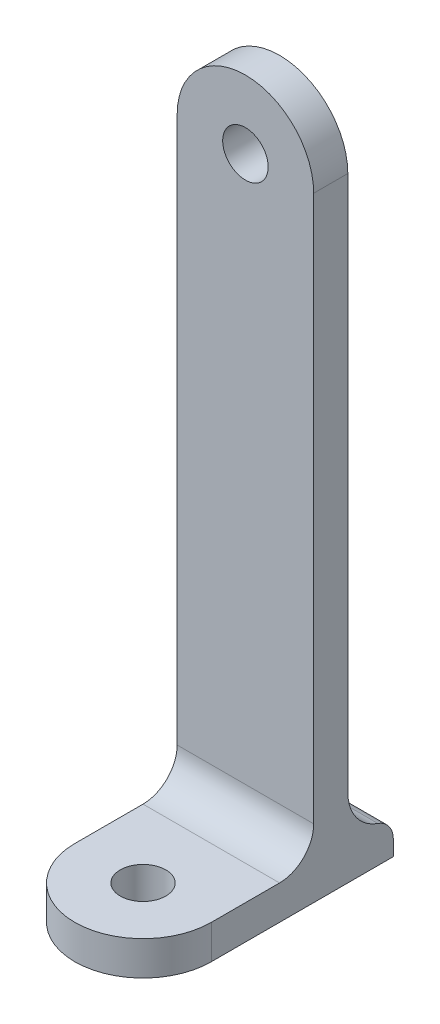
ISO-10303-21;
HEADER;
FILE_DESCRIPTION(('STEP AP214'),'2;1');
FILE_NAME('part.step','',(''),(''),'','','');
FILE_SCHEMA(('AUTOMOTIVE_DESIGN { 1 0 10303 214 1 1 1 1 }'));
ENDSEC;
DATA;
#1=APPLICATION_CONTEXT('core data for automotive mechanical design processes');
#2=APPLICATION_PROTOCOL_DEFINITION('international standard','automotive_design',2000,#1);
#3=PRODUCT_CONTEXT('',#1,'mechanical');
#4=PRODUCT('Part','Part','',(#3));
#5=PRODUCT_RELATED_PRODUCT_CATEGORY('part','',(#4));
#6=PRODUCT_DEFINITION_FORMATION('','',#4);
#7=PRODUCT_DEFINITION_CONTEXT('part definition',#1,'design');
#8=PRODUCT_DEFINITION('design','',#6,#7);
#9=PRODUCT_DEFINITION_SHAPE('','',#8);
#10=(LENGTH_UNIT() NAMED_UNIT(*) SI_UNIT(.MILLI.,.METRE.));
#11=(NAMED_UNIT(*) PLANE_ANGLE_UNIT() SI_UNIT($,.RADIAN.));
#12=(NAMED_UNIT(*) SI_UNIT($,.STERADIAN.) SOLID_ANGLE_UNIT());
#13=UNCERTAINTY_MEASURE_WITH_UNIT(LENGTH_MEASURE(1.E-05),#10,'distance_accuracy_value','');
#14=(GEOMETRIC_REPRESENTATION_CONTEXT(3) GLOBAL_UNCERTAINTY_ASSIGNED_CONTEXT((#13)) GLOBAL_UNIT_ASSIGNED_CONTEXT((#10,
#11,#12)) REPRESENTATION_CONTEXT('',''));
#15=CARTESIAN_POINT('',(0.,0.,0.));
#16=DIRECTION('',(0.,0.,1.));
#17=DIRECTION('',(1.,0.,0.));
#18=AXIS2_PLACEMENT_3D('',#15,#16,#17);
#19=CARTESIAN_POINT('',(-6.,60.,-9.));
#20=DIRECTION('',(0.,0.,1.));
#21=DIRECTION('',(1.,0.,0.));
#22=AXIS2_PLACEMENT_3D('',#19,#20,#21);
#23=PLANE('',#22);
#24=CARTESIAN_POINT('',(0.,54.,-9.));
#25=DIRECTION('',(0.,0.,1.));
#26=DIRECTION('',(1.,0.,0.));
#27=AXIS2_PLACEMENT_3D('',#24,#25,#26);
#28=CIRCLE('',#27,2.);
#29=CARTESIAN_POINT('',(2.,54.,-9.));
#30=VERTEX_POINT('',#29);
#31=EDGE_CURVE('E176',#30,#30,#28,.T.);
#32=ORIENTED_EDGE('',*,*,#31,.F.);
#33=EDGE_LOOP('',(#32));
#34=FACE_BOUND('',#33,.T.);
#35=DIRECTION('',(0.,-1.,0.));
#36=VECTOR('',#35,1.);
#37=CARTESIAN_POINT('',(-6.,60.,-9.));
#38=LINE('',#37,#36);
#39=CARTESIAN_POINT('',(-6.,54.,-9.));
#40=VERTEX_POINT('',#39);
#41=CARTESIAN_POINT('',(-6.,6.,-9.));
#42=VERTEX_POINT('',#41);
#43=EDGE_CURVE('E186',#40,#42,#38,.T.);
#44=ORIENTED_EDGE('',*,*,#43,.T.);
#45=DIRECTION('',(1.,0.,0.));
#46=VECTOR('',#45,1.);
#47=CARTESIAN_POINT('',(6.,6.,-9.00000000000001));
#48=LINE('',#47,#46);
#49=CARTESIAN_POINT('',(6.,6.,-9.00000000000001));
#50=VERTEX_POINT('',#49);
#51=EDGE_CURVE('E224',#42,#50,#48,.T.);
#52=ORIENTED_EDGE('',*,*,#51,.T.);
#53=DIRECTION('',(0.,-1.,0.));
#54=VECTOR('',#53,1.);
#55=CARTESIAN_POINT('',(6.,60.,-9.));
#56=LINE('',#55,#54);
#57=CARTESIAN_POINT('',(6.,54.,-9.));
#58=VERTEX_POINT('',#57);
#59=EDGE_CURVE('E162',#58,#50,#56,.T.);
#60=ORIENTED_EDGE('',*,*,#59,.F.);
#61=CARTESIAN_POINT('',(0.,54.,-9.));
#62=DIRECTION('',(0.,0.,1.));
#63=DIRECTION('',(1.,0.,0.));
#64=AXIS2_PLACEMENT_3D('',#61,#62,#63);
#65=CIRCLE('',#64,6.);
#66=EDGE_CURVE('E172',#58,#40,#65,.T.);
#67=ORIENTED_EDGE('',*,*,#66,.T.);
#68=EDGE_LOOP('',(#44,#52,#60,#67));
#69=FACE_BOUND('',#68,.T.);
#70=ADVANCED_FACE('F77',(#34,#69),#23,.T.);
#71=CARTESIAN_POINT('',(-6.,3.,-12.));
#72=DIRECTION('',(0.,0.,-1.));
#73=DIRECTION('',(-1.,0.,0.));
#74=AXIS2_PLACEMENT_3D('',#71,#72,#73);
#75=PLANE('',#74);
#76=CARTESIAN_POINT('',(0.,54.,-12.));
#77=DIRECTION('',(0.,0.,-1.));
#78=DIRECTION('',(-1.,0.,0.));
#79=AXIS2_PLACEMENT_3D('',#76,#77,#78);
#80=CIRCLE('',#79,2.);
#81=CARTESIAN_POINT('',(-2.00000000000001,54.,-12.));
#82=VERTEX_POINT('',#81);
#83=EDGE_CURVE('E179',#82,#82,#80,.F.);
#84=ORIENTED_EDGE('',*,*,#83,.T.);
#85=EDGE_LOOP('',(#84));
#86=FACE_BOUND('',#85,.T.);
#87=DIRECTION('',(0.,1.,0.));
#88=VECTOR('',#87,1.);
#89=CARTESIAN_POINT('',(6.,3.,-12.));
#90=LINE('',#89,#88);
#91=CARTESIAN_POINT('',(6.,6.9,-12.));
#92=VERTEX_POINT('',#91);
#93=CARTESIAN_POINT('',(6.,54.,-12.));
#94=VERTEX_POINT('',#93);
#95=EDGE_CURVE('E152',#92,#94,#90,.T.);
#96=ORIENTED_EDGE('',*,*,#95,.F.);
#97=DIRECTION('',(1.,0.,0.));
#98=VECTOR('',#97,1.);
#99=CARTESIAN_POINT('',(-6.,6.9,-12.));
#100=LINE('',#99,#98);
#101=CARTESIAN_POINT('',(-6.,6.9,-12.));
#102=VERTEX_POINT('',#101);
#103=EDGE_CURVE('E233',#92,#102,#100,.F.);
#104=ORIENTED_EDGE('',*,*,#103,.T.);
#105=DIRECTION('',(0.,1.,0.));
#106=VECTOR('',#105,1.);
#107=CARTESIAN_POINT('',(-6.,3.,-12.));
#108=LINE('',#107,#106);
#109=CARTESIAN_POINT('',(-6.,54.,-12.));
#110=VERTEX_POINT('',#109);
#111=EDGE_CURVE('E169',#102,#110,#108,.T.);
#112=ORIENTED_EDGE('',*,*,#111,.T.);
#113=CARTESIAN_POINT('',(0.,54.,-12.));
#114=DIRECTION('',(0.,0.,-1.));
#115=DIRECTION('',(-1.,0.,0.));
#116=AXIS2_PLACEMENT_3D('',#113,#114,#115);
#117=CIRCLE('',#116,6.);
#118=EDGE_CURVE('E166',#94,#110,#117,.F.);
#119=ORIENTED_EDGE('',*,*,#118,.F.);
#120=EDGE_LOOP('',(#96,#104,#112,#119));
#121=FACE_BOUND('',#120,.T.);
#122=ADVANCED_FACE('F167',(#86,#121),#75,.T.);
#123=CARTESIAN_POINT('',(6.,3.,0.));
#124=DIRECTION('',(1.,0.,0.));
#125=DIRECTION('',(0.,0.,-1.));
#126=AXIS2_PLACEMENT_3D('',#123,#124,#125);
#127=PLANE('',#126);
#128=DIRECTION('',(0.,-1.,0.));
#129=VECTOR('',#128,1.);
#130=CARTESIAN_POINT('',(6.,3.,-16.));
#131=LINE('',#130,#129);
#132=CARTESIAN_POINT('',(6.,1.31430398249242,-16.));
#133=VERTEX_POINT('',#132);
#134=CARTESIAN_POINT('',(6.,0.,-16.));
#135=VERTEX_POINT('',#134);
#136=EDGE_CURVE('E218',#133,#135,#131,.T.);
#137=ORIENTED_EDGE('',*,*,#136,.F.);
#138=CARTESIAN_POINT('',(6.,1.31430398249242,-14.));
#139=DIRECTION('',(1.,0.,0.));
#140=DIRECTION('',(0.,0.,-1.));
#141=AXIS2_PLACEMENT_3D('',#138,#139,#140);
#142=CIRCLE('',#141,2.);
#143=CARTESIAN_POINT('',(6.,3.20776025961363,-14.6440677966102));
#144=VERTEX_POINT('',#143);
#145=EDGE_CURVE('E99',#133,#144,#142,.T.);
#146=ORIENTED_EDGE('',*,*,#145,.T.);
#147=CARTESIAN_POINT('',(6.,6.9,-15.9));
#148=DIRECTION('',(1.,0.,0.));
#149=DIRECTION('',(0.,0.,-1.));
#150=AXIS2_PLACEMENT_3D('',#147,#148,#149);
#151=CIRCLE('',#150,3.9);
#152=EDGE_CURVE('E159',#144,#92,#151,.F.);
#153=ORIENTED_EDGE('',*,*,#152,.T.);
#154=ORIENTED_EDGE('',*,*,#95,.T.);
#155=DIRECTION('',(0.,0.,1.));
#156=VECTOR('',#155,1.);
#157=CARTESIAN_POINT('',(6.,54.,-16.001));
#158=LINE('',#157,#156);
#159=EDGE_CURVE('E157',#94,#58,#158,.T.);
#160=ORIENTED_EDGE('',*,*,#159,.T.);
#161=ORIENTED_EDGE('',*,*,#59,.T.);
#162=CARTESIAN_POINT('',(6.,6.,-6.));
#163=DIRECTION('',(1.,0.,0.));
#164=DIRECTION('',(0.,0.,-1.));
#165=AXIS2_PLACEMENT_3D('',#162,#163,#164);
#166=CIRCLE('',#165,3.);
#167=CARTESIAN_POINT('',(6.,3.,-6.));
#168=VERTEX_POINT('',#167);
#169=EDGE_CURVE('E229',#50,#168,#166,.F.);
#170=ORIENTED_EDGE('',*,*,#169,.T.);
#171=DIRECTION('',(0.,0.,1.));
#172=VECTOR('',#171,1.);
#173=CARTESIAN_POINT('',(6.,3.,0.));
#174=LINE('',#173,#172);
#175=CARTESIAN_POINT('',(6.,3.,0.));
#176=VERTEX_POINT('',#175);
#177=EDGE_CURVE('E198',#168,#176,#174,.T.);
#178=ORIENTED_EDGE('',*,*,#177,.T.);
#179=DIRECTION('',(0.,-1.,0.));
#180=VECTOR('',#179,1.);
#181=CARTESIAN_POINT('',(6.,3.,0.));
#182=LINE('',#181,#180);
#183=CARTESIAN_POINT('',(6.,0.,0.));
#184=VERTEX_POINT('',#183);
#185=EDGE_CURVE('E220',#176,#184,#182,.T.);
#186=ORIENTED_EDGE('',*,*,#185,.T.);
#187=DIRECTION('',(0.,0.,1.));
#188=VECTOR('',#187,1.);
#189=CARTESIAN_POINT('',(6.,0.,0.));
#190=LINE('',#189,#188);
#191=EDGE_CURVE('E209',#135,#184,#190,.T.);
#192=ORIENTED_EDGE('',*,*,#191,.F.);
#193=EDGE_LOOP('',(#137,#146,#153,#154,#160,#161,#170,#178,#186,#192));
#194=FACE_BOUND('',#193,.T.);
#195=ADVANCED_FACE('F154',(#194),#127,.T.);
#196=CARTESIAN_POINT('',(-6.,3.,0.));
#197=DIRECTION('',(-1.,0.,0.));
#198=DIRECTION('',(0.,0.,1.));
#199=AXIS2_PLACEMENT_3D('',#196,#197,#198);
#200=PLANE('',#199);
#201=CARTESIAN_POINT('',(-6.,6.9,-15.9));
#202=DIRECTION('',(-1.,0.,0.));
#203=DIRECTION('',(0.,0.,1.));
#204=AXIS2_PLACEMENT_3D('',#201,#202,#203);
#205=CIRCLE('',#204,3.9);
#206=CARTESIAN_POINT('',(-6.,3.20776025961364,-14.6440677966102));
#207=VERTEX_POINT('',#206);
#208=EDGE_CURVE('E236',#102,#207,#205,.F.);
#209=ORIENTED_EDGE('',*,*,#208,.T.);
#210=CARTESIAN_POINT('',(-6.,1.31430398249242,-14.));
#211=DIRECTION('',(-1.,0.,0.));
#212=DIRECTION('',(0.,0.,1.));
#213=AXIS2_PLACEMENT_3D('',#210,#211,#212);
#214=CIRCLE('',#213,2.);
#215=CARTESIAN_POINT('',(-6.,1.31430398249242,-16.));
#216=VERTEX_POINT('',#215);
#217=EDGE_CURVE('E12',#207,#216,#214,.T.);
#218=ORIENTED_EDGE('',*,*,#217,.T.);
#219=DIRECTION('',(0.,-1.,0.));
#220=VECTOR('',#219,1.);
#221=CARTESIAN_POINT('',(-6.,3.,-16.));
#222=LINE('',#221,#220);
#223=CARTESIAN_POINT('',(-6.,0.,-16.));
#224=VERTEX_POINT('',#223);
#225=EDGE_CURVE('E203',#216,#224,#222,.T.);
#226=ORIENTED_EDGE('',*,*,#225,.T.);
#227=DIRECTION('',(0.,0.,-1.));
#228=VECTOR('',#227,1.);
#229=CARTESIAN_POINT('',(-6.,0.,0.));
#230=LINE('',#229,#228);
#231=CARTESIAN_POINT('',(-6.,0.,0.));
#232=VERTEX_POINT('',#231);
#233=EDGE_CURVE('E188',#232,#224,#230,.T.);
#234=ORIENTED_EDGE('',*,*,#233,.F.);
#235=DIRECTION('',(0.,-1.,0.));
#236=VECTOR('',#235,1.);
#237=CARTESIAN_POINT('',(-6.,3.,0.));
#238=LINE('',#237,#236);
#239=CARTESIAN_POINT('',(-6.,3.,0.));
#240=VERTEX_POINT('',#239);
#241=EDGE_CURVE('E222',#240,#232,#238,.T.);
#242=ORIENTED_EDGE('',*,*,#241,.F.);
#243=DIRECTION('',(0.,0.,-1.));
#244=VECTOR('',#243,1.);
#245=CARTESIAN_POINT('',(-6.,3.,0.));
#246=LINE('',#245,#244);
#247=CARTESIAN_POINT('',(-6.,3.,-6.));
#248=VERTEX_POINT('',#247);
#249=EDGE_CURVE('E191',#240,#248,#246,.T.);
#250=ORIENTED_EDGE('',*,*,#249,.T.);
#251=CARTESIAN_POINT('',(-6.,6.,-6.));
#252=DIRECTION('',(-1.,0.,0.));
#253=DIRECTION('',(0.,0.,1.));
#254=AXIS2_PLACEMENT_3D('',#251,#252,#253);
#255=CIRCLE('',#254,3.);
#256=EDGE_CURVE('E231',#248,#42,#255,.F.);
#257=ORIENTED_EDGE('',*,*,#256,.T.);
#258=ORIENTED_EDGE('',*,*,#43,.F.);
#259=DIRECTION('',(0.,0.,1.));
#260=VECTOR('',#259,1.);
#261=CARTESIAN_POINT('',(-6.,54.,-16.001));
#262=LINE('',#261,#260);
#263=EDGE_CURVE('E163',#110,#40,#262,.T.);
#264=ORIENTED_EDGE('',*,*,#263,.F.);
#265=ORIENTED_EDGE('',*,*,#111,.F.);
#266=EDGE_LOOP('',(#209,#218,#226,#234,#242,#250,#257,#258,#264,#265));
#267=FACE_BOUND('',#266,.T.);
#268=ADVANCED_FACE('F256',(#267),#200,.T.);
#269=CARTESIAN_POINT('',(0.,3.,0.));
#270=DIRECTION('',(0.,-1.,0.));
#271=DIRECTION('',(0.,0.,-1.));
#272=AXIS2_PLACEMENT_3D('',#269,#270,#271);
#273=CYLINDRICAL_SURFACE('',#272,6.);
#274=CARTESIAN_POINT('',(0.,0.,0.));
#275=DIRECTION('',(0.,1.,0.));
#276=DIRECTION('',(0.,0.,1.));
#277=AXIS2_PLACEMENT_3D('',#274,#275,#276);
#278=CIRCLE('',#277,6.);
#279=EDGE_CURVE('E206',#232,#184,#278,.T.);
#280=ORIENTED_EDGE('',*,*,#279,.T.);
#281=ORIENTED_EDGE('',*,*,#185,.F.);
#282=CARTESIAN_POINT('',(0.,3.,0.));
#283=DIRECTION('',(0.,1.,0.));
#284=DIRECTION('',(0.,0.,1.));
#285=AXIS2_PLACEMENT_3D('',#282,#283,#284);
#286=CIRCLE('',#285,6.);
#287=EDGE_CURVE('E194',#240,#176,#286,.T.);
#288=ORIENTED_EDGE('',*,*,#287,.F.);
#289=ORIENTED_EDGE('',*,*,#241,.T.);
#290=EDGE_LOOP('',(#280,#281,#288,#289));
#291=FACE_BOUND('',#290,.T.);
#292=ADVANCED_FACE('F289',(#291),#273,.T.);
#293=CARTESIAN_POINT('',(0.,3.,-16.));
#294=DIRECTION('',(0.,0.,-1.));
#295=DIRECTION('',(-1.,0.,0.));
#296=AXIS2_PLACEMENT_3D('',#293,#294,#295);
#297=PLANE('',#296);
#298=ORIENTED_EDGE('',*,*,#225,.F.);
#299=DIRECTION('',(1.,0.,0.));
#300=VECTOR('',#299,1.);
#301=CARTESIAN_POINT('',(6.,1.31430398249242,-16.));
#302=LINE('',#301,#300);
#303=EDGE_CURVE('E238',#216,#133,#302,.T.);
#304=ORIENTED_EDGE('',*,*,#303,.T.);
#305=ORIENTED_EDGE('',*,*,#136,.T.);
#306=DIRECTION('',(1.,0.,0.));
#307=VECTOR('',#306,1.);
#308=CARTESIAN_POINT('',(0.,0.,-16.));
#309=LINE('',#308,#307);
#310=EDGE_CURVE('E212',#224,#135,#309,.T.);
#311=ORIENTED_EDGE('',*,*,#310,.F.);
#312=EDGE_LOOP('',(#298,#304,#305,#311));
#313=FACE_BOUND('',#312,.T.);
#314=ADVANCED_FACE('F244',(#313),#297,.T.);
#315=CARTESIAN_POINT('',(0.,3.,0.));
#316=DIRECTION('',(0.,-1.,0.));
#317=DIRECTION('',(0.,0.,-1.));
#318=AXIS2_PLACEMENT_3D('',#315,#316,#317);
#319=CYLINDRICAL_SURFACE('',#318,2.);
#320=CARTESIAN_POINT('',(0.,3.,0.));
#321=DIRECTION('',(0.,1.,0.));
#322=DIRECTION('',(0.,0.,1.));
#323=AXIS2_PLACEMENT_3D('',#320,#321,#322);
#324=CIRCLE('',#323,2.);
#325=CARTESIAN_POINT('',(0.,3.,2.));
#326=VERTEX_POINT('',#325);
#327=EDGE_CURVE('E200',#326,#326,#324,.T.);
#328=ORIENTED_EDGE('',*,*,#327,.T.);
#329=EDGE_LOOP('',(#328));
#330=FACE_BOUND('',#329,.T.);
#331=CARTESIAN_POINT('',(0.,0.,0.));
#332=DIRECTION('',(0.,1.,0.));
#333=DIRECTION('',(0.,0.,1.));
#334=AXIS2_PLACEMENT_3D('',#331,#332,#333);
#335=CIRCLE('',#334,2.);
#336=CARTESIAN_POINT('',(0.,0.,2.));
#337=VERTEX_POINT('',#336);
#338=EDGE_CURVE('E195',#337,#337,#335,.T.);
#339=ORIENTED_EDGE('',*,*,#338,.F.);
#340=EDGE_LOOP('',(#339));
#341=FACE_BOUND('',#340,.T.);
#342=ADVANCED_FACE('F280',(#330,#341),#319,.F.);
#343=CARTESIAN_POINT('',(0.,3.,0.));
#344=DIRECTION('',(0.,1.,0.));
#345=DIRECTION('',(0.,0.,1.));
#346=AXIS2_PLACEMENT_3D('',#343,#344,#345);
#347=PLANE('',#346);
#348=ORIENTED_EDGE('',*,*,#177,.F.);
#349=DIRECTION('',(1.,0.,0.));
#350=VECTOR('',#349,1.);
#351=CARTESIAN_POINT('',(-6.,3.,-6.));
#352=LINE('',#351,#350);
#353=EDGE_CURVE('E227',#168,#248,#352,.F.);
#354=ORIENTED_EDGE('',*,*,#353,.T.);
#355=ORIENTED_EDGE('',*,*,#249,.F.);
#356=ORIENTED_EDGE('',*,*,#287,.T.);
#357=EDGE_LOOP('',(#348,#354,#355,#356));
#358=FACE_BOUND('',#357,.T.);
#359=ORIENTED_EDGE('',*,*,#327,.F.);
#360=EDGE_LOOP('',(#359));
#361=FACE_BOUND('',#360,.T.);
#362=ADVANCED_FACE('F277',(#358,#361),#347,.T.);
#363=CARTESIAN_POINT('',(0.,0.,0.));
#364=DIRECTION('',(0.,1.,0.));
#365=DIRECTION('',(0.,0.,1.));
#366=AXIS2_PLACEMENT_3D('',#363,#364,#365);
#367=PLANE('',#366);
#368=ORIENTED_EDGE('',*,*,#233,.T.);
#369=ORIENTED_EDGE('',*,*,#310,.T.);
#370=ORIENTED_EDGE('',*,*,#191,.T.);
#371=ORIENTED_EDGE('',*,*,#279,.F.);
#372=EDGE_LOOP('',(#368,#369,#370,#371));
#373=FACE_BOUND('',#372,.T.);
#374=ORIENTED_EDGE('',*,*,#338,.T.);
#375=EDGE_LOOP('',(#374));
#376=FACE_BOUND('',#375,.T.);
#377=ADVANCED_FACE('F252',(#373,#376),#367,.F.);
#378=CARTESIAN_POINT('',(0.,54.,-16.001));
#379=DIRECTION('',(0.,0.,1.));
#380=DIRECTION('',(1.,0.,0.));
#381=AXIS2_PLACEMENT_3D('',#378,#379,#380);
#382=CYLINDRICAL_SURFACE('',#381,6.);
#383=ORIENTED_EDGE('',*,*,#118,.T.);
#384=ORIENTED_EDGE('',*,*,#263,.T.);
#385=ORIENTED_EDGE('',*,*,#66,.F.);
#386=ORIENTED_EDGE('',*,*,#159,.F.);
#387=EDGE_LOOP('',(#383,#384,#385,#386));
#388=FACE_BOUND('',#387,.T.);
#389=ADVANCED_FACE('F174',(#388),#382,.T.);
#390=CARTESIAN_POINT('',(0.,54.,-16.001));
#391=DIRECTION('',(0.,0.,1.));
#392=DIRECTION('',(1.,0.,0.));
#393=AXIS2_PLACEMENT_3D('',#390,#391,#392);
#394=CYLINDRICAL_SURFACE('',#393,2.);
#395=ORIENTED_EDGE('',*,*,#83,.F.);
#396=EDGE_LOOP('',(#395));
#397=FACE_BOUND('',#396,.T.);
#398=ORIENTED_EDGE('',*,*,#31,.T.);
#399=EDGE_LOOP('',(#398));
#400=FACE_BOUND('',#399,.T.);
#401=ADVANCED_FACE('F298',(#397,#400),#394,.F.);
#402=CARTESIAN_POINT('',(-6.,6.,-6.));
#403=DIRECTION('',(-1.,0.,0.));
#404=DIRECTION('',(0.,0.,1.));
#405=AXIS2_PLACEMENT_3D('',#402,#403,#404);
#406=CYLINDRICAL_SURFACE('',#405,3.);
#407=ORIENTED_EDGE('',*,*,#256,.F.);
#408=ORIENTED_EDGE('',*,*,#353,.F.);
#409=ORIENTED_EDGE('',*,*,#169,.F.);
#410=ORIENTED_EDGE('',*,*,#51,.F.);
#411=EDGE_LOOP('',(#407,#408,#409,#410));
#412=FACE_BOUND('',#411,.T.);
#413=ADVANCED_FACE('F263',(#412),#406,.F.);
#414=CARTESIAN_POINT('',(0.,6.9,-15.9));
#415=DIRECTION('',(-1.,0.,0.));
#416=DIRECTION('',(0.,0.,1.));
#417=AXIS2_PLACEMENT_3D('',#414,#415,#416);
#418=CYLINDRICAL_SURFACE('',#417,3.9);
#419=ORIENTED_EDGE('',*,*,#152,.F.);
#420=DIRECTION('',(-1.,0.,0.));
#421=VECTOR('',#420,1.);
#422=CARTESIAN_POINT('',(0.,3.20776025961363,-14.6440677966102));
#423=LINE('',#422,#421);
#424=EDGE_CURVE('E85',#144,#207,#423,.T.);
#425=ORIENTED_EDGE('',*,*,#424,.T.);
#426=ORIENTED_EDGE('',*,*,#208,.F.);
#427=ORIENTED_EDGE('',*,*,#103,.F.);
#428=EDGE_LOOP('',(#419,#425,#426,#427));
#429=FACE_BOUND('',#428,.T.);
#430=ADVANCED_FACE('F259',(#429),#418,.F.);
#431=CARTESIAN_POINT('',(0.,1.31430398249242,-14.));
#432=DIRECTION('',(-1.,0.,0.));
#433=DIRECTION('',(0.,0.,1.));
#434=AXIS2_PLACEMENT_3D('',#431,#432,#433);
#435=CYLINDRICAL_SURFACE('',#434,2.);
#436=ORIENTED_EDGE('',*,*,#217,.F.);
#437=ORIENTED_EDGE('',*,*,#424,.F.);
#438=ORIENTED_EDGE('',*,*,#145,.F.);
#439=ORIENTED_EDGE('',*,*,#303,.F.);
#440=EDGE_LOOP('',(#436,#437,#438,#439));
#441=FACE_BOUND('',#440,.T.);
#442=ADVANCED_FACE('F79',(#441),#435,.T.);
#443=CLOSED_SHELL('',(#70,#122,#195,#268,#292,#314,#342,#362,#377,#389,#401,#413,#430,#442));
#444=MANIFOLD_SOLID_BREP('B2',#443);
#445=ADVANCED_BREP_SHAPE_REPRESENTATION('',(#18,#444),#14);
#446=SHAPE_DEFINITION_REPRESENTATION(#9,#445);
ENDSEC;
END-ISO-10303-21;
